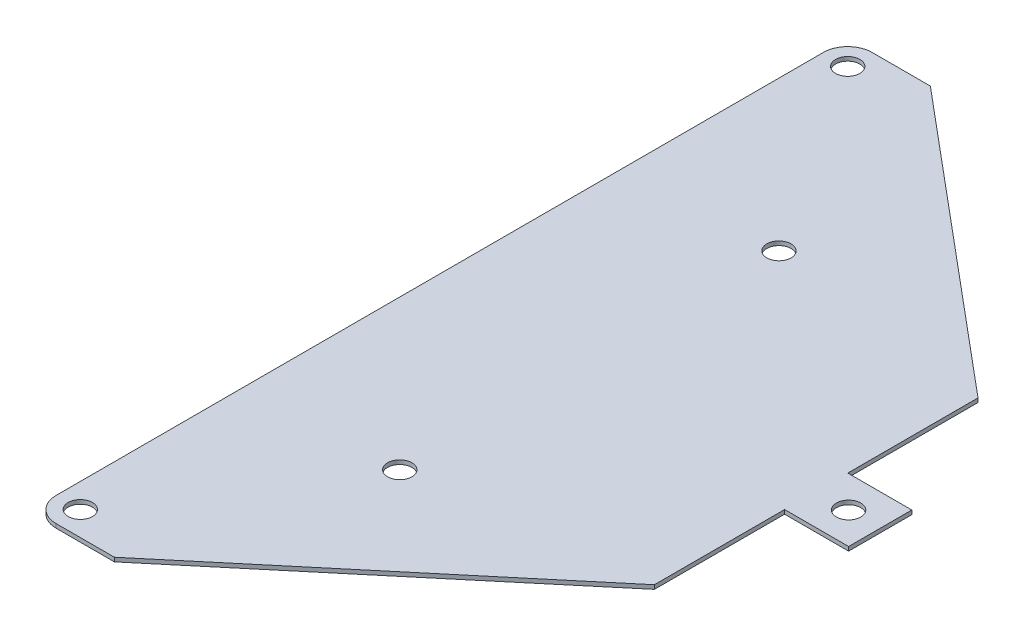
ISO-10303-21;
HEADER;
FILE_DESCRIPTION(('STEP AP214'),'2;1');
FILE_NAME('part.step','',(''),(''),'','','');
FILE_SCHEMA(('AUTOMOTIVE_DESIGN { 1 0 10303 214 1 1 1 1 }'));
ENDSEC;
DATA;
#1=APPLICATION_CONTEXT('core data for automotive mechanical design processes');
#2=APPLICATION_PROTOCOL_DEFINITION('international standard','automotive_design',2000,#1);
#3=PRODUCT_CONTEXT('',#1,'mechanical');
#4=PRODUCT('Part','Part','',(#3));
#5=PRODUCT_RELATED_PRODUCT_CATEGORY('part','',(#4));
#6=PRODUCT_DEFINITION_FORMATION('','',#4);
#7=PRODUCT_DEFINITION_CONTEXT('part definition',#1,'design');
#8=PRODUCT_DEFINITION('design','',#6,#7);
#9=PRODUCT_DEFINITION_SHAPE('','',#8);
#10=(LENGTH_UNIT() NAMED_UNIT(*) SI_UNIT(.MILLI.,.METRE.));
#11=(NAMED_UNIT(*) PLANE_ANGLE_UNIT() SI_UNIT($,.RADIAN.));
#12=(NAMED_UNIT(*) SI_UNIT($,.STERADIAN.) SOLID_ANGLE_UNIT());
#13=UNCERTAINTY_MEASURE_WITH_UNIT(LENGTH_MEASURE(1.E-05),#10,'distance_accuracy_value','');
#14=(GEOMETRIC_REPRESENTATION_CONTEXT(3) GLOBAL_UNCERTAINTY_ASSIGNED_CONTEXT((#13)) GLOBAL_UNIT_ASSIGNED_CONTEXT((#10,
#11,#12)) REPRESENTATION_CONTEXT('',''));
#15=CARTESIAN_POINT('',(0.,0.,0.));
#16=DIRECTION('',(0.,0.,1.));
#17=DIRECTION('',(1.,0.,0.));
#18=AXIS2_PLACEMENT_3D('',#15,#16,#17);
#19=CARTESIAN_POINT('',(0.,0.5,0.));
#20=DIRECTION('',(0.,-1.,0.));
#21=DIRECTION('',(0.,0.,-1.));
#22=AXIS2_PLACEMENT_3D('',#19,#20,#21);
#23=PLANE('',#22);
#24=DIRECTION('',(0.,0.,-1.));
#25=VECTOR('',#24,1.);
#26=CARTESIAN_POINT('',(43.47,0.5,43.46));
#27=LINE('',#26,#25);
#28=CARTESIAN_POINT('',(43.47,0.5,43.46));
#29=VERTEX_POINT('',#28);
#30=CARTESIAN_POINT('',(43.47,0.5,27.39));
#31=VERTEX_POINT('',#30);
#32=EDGE_CURVE('E181',#29,#31,#27,.T.);
#33=ORIENTED_EDGE('',*,*,#32,.T.);
#34=DIRECTION('',(-0.766503610582019,0.,-0.642239997948375));
#35=VECTOR('',#34,1.);
#36=CARTESIAN_POINT('',(43.47,0.5,27.39));
#37=LINE('',#36,#35);
#38=CARTESIAN_POINT('',(7.20000000000001,0.5,-3.));
#39=VERTEX_POINT('',#38);
#40=EDGE_CURVE('E112',#31,#39,#37,.T.);
#41=ORIENTED_EDGE('',*,*,#40,.T.);
#42=DIRECTION('',(-1.,0.,0.));
#43=VECTOR('',#42,1.);
#44=CARTESIAN_POINT('',(7.20000000000001,0.5,-3.));
#45=LINE('',#44,#43);
#46=CARTESIAN_POINT('',(0.,0.5,-3.));
#47=VERTEX_POINT('',#46);
#48=EDGE_CURVE('E209',#39,#47,#45,.T.);
#49=ORIENTED_EDGE('',*,*,#48,.T.);
#50=CARTESIAN_POINT('',(0.,0.5,0.));
#51=DIRECTION('',(0.,1.,0.));
#52=DIRECTION('',(0.,0.,-1.));
#53=AXIS2_PLACEMENT_3D('',#50,#51,#52);
#54=CIRCLE('',#53,3.);
#55=CARTESIAN_POINT('',(-3.,0.5,0.));
#56=VERTEX_POINT('',#55);
#57=EDGE_CURVE('E228',#47,#56,#54,.T.);
#58=ORIENTED_EDGE('',*,*,#57,.T.);
#59=DIRECTION('',(0.,0.,1.));
#60=VECTOR('',#59,1.);
#61=CARTESIAN_POINT('',(-3.,0.5,94.72));
#62=LINE('',#61,#60);
#63=CARTESIAN_POINT('',(-3.,0.5,94.72));
#64=VERTEX_POINT('',#63);
#65=EDGE_CURVE('E226',#56,#64,#62,.T.);
#66=ORIENTED_EDGE('',*,*,#65,.T.);
#67=CARTESIAN_POINT('',(0.,0.5,94.72));
#68=DIRECTION('',(0.,1.,0.));
#69=DIRECTION('',(0.,0.,-1.));
#70=AXIS2_PLACEMENT_3D('',#67,#68,#69);
#71=CIRCLE('',#70,3.);
#72=CARTESIAN_POINT('',(0.,0.5,97.72));
#73=VERTEX_POINT('',#72);
#74=EDGE_CURVE('E229',#64,#73,#71,.T.);
#75=ORIENTED_EDGE('',*,*,#74,.T.);
#76=DIRECTION('',(1.,0.,0.));
#77=VECTOR('',#76,1.);
#78=CARTESIAN_POINT('',(0.,0.5,97.72));
#79=LINE('',#78,#77);
#80=CARTESIAN_POINT('',(7.20000000000001,0.5,97.72));
#81=VERTEX_POINT('',#80);
#82=EDGE_CURVE('E233',#73,#81,#79,.T.);
#83=ORIENTED_EDGE('',*,*,#82,.T.);
#84=DIRECTION('',(0.766503610582019,0.,-0.642239997948375));
#85=VECTOR('',#84,1.);
#86=CARTESIAN_POINT('',(7.20000000000001,0.5,97.72));
#87=LINE('',#86,#85);
#88=CARTESIAN_POINT('',(43.47,0.5,67.33));
#89=VERTEX_POINT('',#88);
#90=EDGE_CURVE('E240',#81,#89,#87,.T.);
#91=ORIENTED_EDGE('',*,*,#90,.T.);
#92=DIRECTION('',(0.,0.,-1.));
#93=VECTOR('',#92,1.);
#94=CARTESIAN_POINT('',(43.47,0.5,67.33));
#95=LINE('',#94,#93);
#96=CARTESIAN_POINT('',(43.47,0.5,51.26));
#97=VERTEX_POINT('',#96);
#98=EDGE_CURVE('E142',#89,#97,#95,.T.);
#99=ORIENTED_EDGE('',*,*,#98,.T.);
#100=DIRECTION('',(1.,0.,0.));
#101=VECTOR('',#100,1.);
#102=CARTESIAN_POINT('',(51.37,0.5,51.26));
#103=LINE('',#102,#101);
#104=CARTESIAN_POINT('',(51.37,0.5,51.26));
#105=VERTEX_POINT('',#104);
#106=EDGE_CURVE('E138',#97,#105,#103,.T.);
#107=ORIENTED_EDGE('',*,*,#106,.T.);
#108=DIRECTION('',(0.,0.,-1.));
#109=VECTOR('',#108,1.);
#110=CARTESIAN_POINT('',(51.37,0.5,43.46));
#111=LINE('',#110,#109);
#112=CARTESIAN_POINT('',(51.37,0.5,43.46));
#113=VERTEX_POINT('',#112);
#114=EDGE_CURVE('E136',#105,#113,#111,.T.);
#115=ORIENTED_EDGE('',*,*,#114,.T.);
#116=DIRECTION('',(-1.,0.,0.));
#117=VECTOR('',#116,1.);
#118=CARTESIAN_POINT('',(43.47,0.5,43.46));
#119=LINE('',#118,#117);
#120=EDGE_CURVE('E57',#113,#29,#119,.T.);
#121=ORIENTED_EDGE('',*,*,#120,.T.);
#122=EDGE_LOOP('',(#33,#41,#49,#58,#66,#75,#83,#91,#99,#107,#115,#121));
#123=FACE_BOUND('',#122,.T.);
#124=CARTESIAN_POINT('',(0.,0.5,0.));
#125=DIRECTION('',(0.,1.,0.));
#126=DIRECTION('',(0.,0.,1.));
#127=AXIS2_PLACEMENT_3D('',#124,#125,#126);
#128=CIRCLE('',#127,1.5);
#129=CARTESIAN_POINT('',(0.,0.5,1.5));
#130=VERTEX_POINT('',#129);
#131=EDGE_CURVE('E163',#130,#130,#128,.T.);
#132=ORIENTED_EDGE('',*,*,#131,.F.);
#133=EDGE_LOOP('',(#132));
#134=FACE_BOUND('',#133,.T.);
#135=CARTESIAN_POINT('',(0.,0.5,94.72));
#136=DIRECTION('',(0.,1.,0.));
#137=DIRECTION('',(0.,0.,1.));
#138=AXIS2_PLACEMENT_3D('',#135,#136,#137);
#139=CIRCLE('',#138,1.5);
#140=CARTESIAN_POINT('',(0.,0.5,96.22));
#141=VERTEX_POINT('',#140);
#142=EDGE_CURVE('E313',#141,#141,#139,.T.);
#143=ORIENTED_EDGE('',*,*,#142,.F.);
#144=EDGE_LOOP('',(#143));
#145=FACE_BOUND('',#144,.T.);
#146=CARTESIAN_POINT('',(47.47,0.5,47.36));
#147=DIRECTION('',(0.,1.,0.));
#148=DIRECTION('',(0.,0.,1.));
#149=AXIS2_PLACEMENT_3D('',#146,#147,#148);
#150=CIRCLE('',#149,1.5);
#151=CARTESIAN_POINT('',(47.47,0.5,48.86));
#152=VERTEX_POINT('',#151);
#153=EDGE_CURVE('E301',#152,#152,#150,.T.);
#154=ORIENTED_EDGE('',*,*,#153,.F.);
#155=EDGE_LOOP('',(#154));
#156=FACE_BOUND('',#155,.T.);
#157=CARTESIAN_POINT('',(15.47,0.5,70.76));
#158=DIRECTION('',(0.,1.,0.));
#159=DIRECTION('',(0.,0.,1.));
#160=AXIS2_PLACEMENT_3D('',#157,#158,#159);
#161=CIRCLE('',#160,1.5);
#162=CARTESIAN_POINT('',(15.47,0.5,72.26));
#163=VERTEX_POINT('',#162);
#164=EDGE_CURVE('E298',#163,#163,#161,.T.);
#165=ORIENTED_EDGE('',*,*,#164,.F.);
#166=EDGE_LOOP('',(#165));
#167=FACE_BOUND('',#166,.T.);
#168=CARTESIAN_POINT('',(15.47,0.5,23.96));
#169=DIRECTION('',(0.,1.,0.));
#170=DIRECTION('',(0.,0.,1.));
#171=AXIS2_PLACEMENT_3D('',#168,#169,#170);
#172=CIRCLE('',#171,1.5);
#173=CARTESIAN_POINT('',(15.47,0.5,25.46));
#174=VERTEX_POINT('',#173);
#175=EDGE_CURVE('E286',#174,#174,#172,.T.);
#176=ORIENTED_EDGE('',*,*,#175,.F.);
#177=EDGE_LOOP('',(#176));
#178=FACE_BOUND('',#177,.T.);
#179=ADVANCED_FACE('F39',(#123,#134,#145,#156,#167,#178),#23,.F.);
#180=CARTESIAN_POINT('',(0.,0.,0.));
#181=DIRECTION('',(0.,-1.,0.));
#182=DIRECTION('',(0.,0.,-1.));
#183=AXIS2_PLACEMENT_3D('',#180,#181,#182);
#184=PLANE('',#183);
#185=CARTESIAN_POINT('',(15.47,0.,70.76));
#186=DIRECTION('',(0.,1.,0.));
#187=DIRECTION('',(0.,0.,1.));
#188=AXIS2_PLACEMENT_3D('',#185,#186,#187);
#189=CIRCLE('',#188,1.5);
#190=CARTESIAN_POINT('',(15.47,0.,72.26));
#191=VERTEX_POINT('',#190);
#192=EDGE_CURVE('E296',#191,#191,#189,.T.);
#193=ORIENTED_EDGE('',*,*,#192,.T.);
#194=EDGE_LOOP('',(#193));
#195=FACE_BOUND('',#194,.T.);
#196=CARTESIAN_POINT('',(0.,0.,94.72));
#197=DIRECTION('',(0.,1.,0.));
#198=DIRECTION('',(0.,0.,1.));
#199=AXIS2_PLACEMENT_3D('',#196,#197,#198);
#200=CIRCLE('',#199,1.5);
#201=CARTESIAN_POINT('',(0.,0.,96.22));
#202=VERTEX_POINT('',#201);
#203=EDGE_CURVE('E306',#202,#202,#200,.T.);
#204=ORIENTED_EDGE('',*,*,#203,.T.);
#205=EDGE_LOOP('',(#204));
#206=FACE_BOUND('',#205,.T.);
#207=DIRECTION('',(0.,0.,-1.));
#208=VECTOR('',#207,1.);
#209=CARTESIAN_POINT('',(43.47,0.,43.46));
#210=LINE('',#209,#208);
#211=CARTESIAN_POINT('',(43.47,0.,43.46));
#212=VERTEX_POINT('',#211);
#213=CARTESIAN_POINT('',(43.47,0.,27.39));
#214=VERTEX_POINT('',#213);
#215=EDGE_CURVE('E159',#212,#214,#210,.T.);
#216=ORIENTED_EDGE('',*,*,#215,.F.);
#217=DIRECTION('',(-1.,0.,0.));
#218=VECTOR('',#217,1.);
#219=CARTESIAN_POINT('',(43.47,0.,43.46));
#220=LINE('',#219,#218);
#221=CARTESIAN_POINT('',(51.37,0.,43.46));
#222=VERTEX_POINT('',#221);
#223=EDGE_CURVE('E103',#222,#212,#220,.T.);
#224=ORIENTED_EDGE('',*,*,#223,.F.);
#225=DIRECTION('',(0.,0.,-1.));
#226=VECTOR('',#225,1.);
#227=CARTESIAN_POINT('',(51.37,0.,43.46));
#228=LINE('',#227,#226);
#229=CARTESIAN_POINT('',(51.37,0.,51.26));
#230=VERTEX_POINT('',#229);
#231=EDGE_CURVE('E100',#230,#222,#228,.T.);
#232=ORIENTED_EDGE('',*,*,#231,.F.);
#233=DIRECTION('',(1.,0.,0.));
#234=VECTOR('',#233,1.);
#235=CARTESIAN_POINT('',(51.37,0.,51.26));
#236=LINE('',#235,#234);
#237=CARTESIAN_POINT('',(43.47,0.,51.26));
#238=VERTEX_POINT('',#237);
#239=EDGE_CURVE('E147',#238,#230,#236,.T.);
#240=ORIENTED_EDGE('',*,*,#239,.F.);
#241=DIRECTION('',(0.,0.,-1.));
#242=VECTOR('',#241,1.);
#243=CARTESIAN_POINT('',(43.47,0.,67.33));
#244=LINE('',#243,#242);
#245=CARTESIAN_POINT('',(43.47,0.,67.33));
#246=VERTEX_POINT('',#245);
#247=EDGE_CURVE('E177',#246,#238,#244,.T.);
#248=ORIENTED_EDGE('',*,*,#247,.F.);
#249=DIRECTION('',(0.766503610582019,0.,-0.642239997948375));
#250=VECTOR('',#249,1.);
#251=CARTESIAN_POINT('',(7.20000000000001,0.,97.72));
#252=LINE('',#251,#250);
#253=CARTESIAN_POINT('',(7.20000000000001,0.,97.72));
#254=VERTEX_POINT('',#253);
#255=EDGE_CURVE('E178',#254,#246,#252,.T.);
#256=ORIENTED_EDGE('',*,*,#255,.F.);
#257=DIRECTION('',(1.,0.,0.));
#258=VECTOR('',#257,1.);
#259=CARTESIAN_POINT('',(0.,0.,97.72));
#260=LINE('',#259,#258);
#261=CARTESIAN_POINT('',(0.,0.,97.72));
#262=VERTEX_POINT('',#261);
#263=EDGE_CURVE('E173',#262,#254,#260,.T.);
#264=ORIENTED_EDGE('',*,*,#263,.F.);
#265=CARTESIAN_POINT('',(0.,0.,94.72));
#266=DIRECTION('',(0.,1.,0.));
#267=DIRECTION('',(0.,0.,-1.));
#268=AXIS2_PLACEMENT_3D('',#265,#266,#267);
#269=CIRCLE('',#268,3.);
#270=CARTESIAN_POINT('',(-3.,0.,94.72));
#271=VERTEX_POINT('',#270);
#272=EDGE_CURVE('E172',#271,#262,#269,.T.);
#273=ORIENTED_EDGE('',*,*,#272,.F.);
#274=DIRECTION('',(0.,0.,1.));
#275=VECTOR('',#274,1.);
#276=CARTESIAN_POINT('',(-3.,0.,94.72));
#277=LINE('',#276,#275);
#278=CARTESIAN_POINT('',(-3.,0.,0.));
#279=VERTEX_POINT('',#278);
#280=EDGE_CURVE('E168',#279,#271,#277,.T.);
#281=ORIENTED_EDGE('',*,*,#280,.F.);
#282=CARTESIAN_POINT('',(0.,0.,0.));
#283=DIRECTION('',(0.,1.,0.));
#284=DIRECTION('',(0.,0.,-1.));
#285=AXIS2_PLACEMENT_3D('',#282,#283,#284);
#286=CIRCLE('',#285,3.);
#287=CARTESIAN_POINT('',(0.,0.,-3.));
#288=VERTEX_POINT('',#287);
#289=EDGE_CURVE('E169',#288,#279,#286,.T.);
#290=ORIENTED_EDGE('',*,*,#289,.F.);
#291=DIRECTION('',(-1.,0.,0.));
#292=VECTOR('',#291,1.);
#293=CARTESIAN_POINT('',(7.20000000000001,0.,-3.));
#294=LINE('',#293,#292);
#295=CARTESIAN_POINT('',(7.20000000000001,0.,-3.));
#296=VERTEX_POINT('',#295);
#297=EDGE_CURVE('E167',#296,#288,#294,.T.);
#298=ORIENTED_EDGE('',*,*,#297,.F.);
#299=DIRECTION('',(-0.766503610582019,0.,-0.642239997948375));
#300=VECTOR('',#299,1.);
#301=CARTESIAN_POINT('',(43.47,0.,27.39));
#302=LINE('',#301,#300);
#303=EDGE_CURVE('E162',#214,#296,#302,.T.);
#304=ORIENTED_EDGE('',*,*,#303,.F.);
#305=EDGE_LOOP('',(#216,#224,#232,#240,#248,#256,#264,#273,#281,#290,#298,#304));
#306=FACE_BOUND('',#305,.T.);
#307=CARTESIAN_POINT('',(0.,0.,0.));
#308=DIRECTION('',(0.,1.,0.));
#309=DIRECTION('',(0.,0.,1.));
#310=AXIS2_PLACEMENT_3D('',#307,#308,#309);
#311=CIRCLE('',#310,1.5);
#312=CARTESIAN_POINT('',(0.,0.,1.5));
#313=VERTEX_POINT('',#312);
#314=EDGE_CURVE('E314',#313,#313,#311,.T.);
#315=ORIENTED_EDGE('',*,*,#314,.T.);
#316=EDGE_LOOP('',(#315));
#317=FACE_BOUND('',#316,.T.);
#318=CARTESIAN_POINT('',(47.47,0.,47.36));
#319=DIRECTION('',(0.,1.,0.));
#320=DIRECTION('',(0.,0.,1.));
#321=AXIS2_PLACEMENT_3D('',#318,#319,#320);
#322=CIRCLE('',#321,1.5);
#323=CARTESIAN_POINT('',(47.47,0.,48.86));
#324=VERTEX_POINT('',#323);
#325=EDGE_CURVE('E304',#324,#324,#322,.T.);
#326=ORIENTED_EDGE('',*,*,#325,.T.);
#327=EDGE_LOOP('',(#326));
#328=FACE_BOUND('',#327,.T.);
#329=CARTESIAN_POINT('',(15.47,0.,23.96));
#330=DIRECTION('',(0.,1.,0.));
#331=DIRECTION('',(0.,0.,1.));
#332=AXIS2_PLACEMENT_3D('',#329,#330,#331);
#333=CIRCLE('',#332,1.5);
#334=CARTESIAN_POINT('',(15.47,0.,25.46));
#335=VERTEX_POINT('',#334);
#336=EDGE_CURVE('E291',#335,#335,#333,.T.);
#337=ORIENTED_EDGE('',*,*,#336,.T.);
#338=EDGE_LOOP('',(#337));
#339=FACE_BOUND('',#338,.T.);
#340=ADVANCED_FACE('F212',(#195,#206,#306,#317,#328,#339),#184,.T.);
#341=CARTESIAN_POINT('',(43.47,0.5,43.46));
#342=DIRECTION('',(-1.,0.,0.));
#343=DIRECTION('',(0.,0.,1.));
#344=AXIS2_PLACEMENT_3D('',#341,#342,#343);
#345=PLANE('',#344);
#346=ORIENTED_EDGE('',*,*,#215,.T.);
#347=DIRECTION('',(0.,-1.,0.));
#348=VECTOR('',#347,1.);
#349=CARTESIAN_POINT('',(43.47,0.5,27.39));
#350=LINE('',#349,#348);
#351=EDGE_CURVE('E11',#31,#214,#350,.T.);
#352=ORIENTED_EDGE('',*,*,#351,.F.);
#353=ORIENTED_EDGE('',*,*,#32,.F.);
#354=DIRECTION('',(0.,-1.,0.));
#355=VECTOR('',#354,1.);
#356=CARTESIAN_POINT('',(43.47,0.5,43.46));
#357=LINE('',#356,#355);
#358=EDGE_CURVE('E156',#29,#212,#357,.T.);
#359=ORIENTED_EDGE('',*,*,#358,.T.);
#360=EDGE_LOOP('',(#346,#352,#353,#359));
#361=FACE_BOUND('',#360,.T.);
#362=ADVANCED_FACE('F41',(#361),#345,.F.);
#363=CARTESIAN_POINT('',(43.47,0.5,27.39));
#364=DIRECTION('',(-0.642239997948375,0.,0.766503610582019));
#365=DIRECTION('',(0.766503610582019,0.,0.642239997948375));
#366=AXIS2_PLACEMENT_3D('',#363,#364,#365);
#367=PLANE('',#366);
#368=ORIENTED_EDGE('',*,*,#303,.T.);
#369=DIRECTION('',(0.,-1.,0.));
#370=VECTOR('',#369,1.);
#371=CARTESIAN_POINT('',(7.20000000000001,0.5,-3.));
#372=LINE('',#371,#370);
#373=EDGE_CURVE('E48',#39,#296,#372,.T.);
#374=ORIENTED_EDGE('',*,*,#373,.F.);
#375=ORIENTED_EDGE('',*,*,#40,.F.);
#376=ORIENTED_EDGE('',*,*,#351,.T.);
#377=EDGE_LOOP('',(#368,#374,#375,#376));
#378=FACE_BOUND('',#377,.T.);
#379=ADVANCED_FACE('F439',(#378),#367,.F.);
#380=CARTESIAN_POINT('',(7.20000000000001,0.5,-3.));
#381=DIRECTION('',(0.,0.,1.));
#382=DIRECTION('',(1.,0.,0.));
#383=AXIS2_PLACEMENT_3D('',#380,#381,#382);
#384=PLANE('',#383);
#385=ORIENTED_EDGE('',*,*,#297,.T.);
#386=DIRECTION('',(0.,-1.,0.));
#387=VECTOR('',#386,1.);
#388=CARTESIAN_POINT('',(0.,0.5,-3.));
#389=LINE('',#388,#387);
#390=EDGE_CURVE('E205',#47,#288,#389,.T.);
#391=ORIENTED_EDGE('',*,*,#390,.F.);
#392=ORIENTED_EDGE('',*,*,#48,.F.);
#393=ORIENTED_EDGE('',*,*,#373,.T.);
#394=EDGE_LOOP('',(#385,#391,#392,#393));
#395=FACE_BOUND('',#394,.T.);
#396=ADVANCED_FACE('F208',(#395),#384,.F.);
#397=CARTESIAN_POINT('',(0.,0.5,0.));
#398=DIRECTION('',(0.,-1.,0.));
#399=DIRECTION('',(0.,0.,-1.));
#400=AXIS2_PLACEMENT_3D('',#397,#398,#399);
#401=CYLINDRICAL_SURFACE('',#400,3.);
#402=ORIENTED_EDGE('',*,*,#289,.T.);
#403=DIRECTION('',(0.,-1.,0.));
#404=VECTOR('',#403,1.);
#405=CARTESIAN_POINT('',(-3.,0.5,0.));
#406=LINE('',#405,#404);
#407=EDGE_CURVE('E200',#56,#279,#406,.T.);
#408=ORIENTED_EDGE('',*,*,#407,.F.);
#409=ORIENTED_EDGE('',*,*,#57,.F.);
#410=ORIENTED_EDGE('',*,*,#390,.T.);
#411=EDGE_LOOP('',(#402,#408,#409,#410));
#412=FACE_BOUND('',#411,.T.);
#413=ADVANCED_FACE('F219',(#412),#401,.T.);
#414=CARTESIAN_POINT('',(-3.,0.5,94.72));
#415=DIRECTION('',(1.,0.,0.));
#416=DIRECTION('',(0.,0.,-1.));
#417=AXIS2_PLACEMENT_3D('',#414,#415,#416);
#418=PLANE('',#417);
#419=ORIENTED_EDGE('',*,*,#280,.T.);
#420=DIRECTION('',(0.,-1.,0.));
#421=VECTOR('',#420,1.);
#422=CARTESIAN_POINT('',(-3.,0.5,94.72));
#423=LINE('',#422,#421);
#424=EDGE_CURVE('E198',#64,#271,#423,.T.);
#425=ORIENTED_EDGE('',*,*,#424,.F.);
#426=ORIENTED_EDGE('',*,*,#65,.F.);
#427=ORIENTED_EDGE('',*,*,#407,.T.);
#428=EDGE_LOOP('',(#419,#425,#426,#427));
#429=FACE_BOUND('',#428,.T.);
#430=ADVANCED_FACE('F221',(#429),#418,.F.);
#431=CARTESIAN_POINT('',(0.,0.5,94.72));
#432=DIRECTION('',(0.,-1.,0.));
#433=DIRECTION('',(0.,0.,-1.));
#434=AXIS2_PLACEMENT_3D('',#431,#432,#433);
#435=CYLINDRICAL_SURFACE('',#434,3.);
#436=ORIENTED_EDGE('',*,*,#272,.T.);
#437=DIRECTION('',(0.,-1.,0.));
#438=VECTOR('',#437,1.);
#439=CARTESIAN_POINT('',(0.,0.5,97.72));
#440=LINE('',#439,#438);
#441=EDGE_CURVE('E192',#73,#262,#440,.T.);
#442=ORIENTED_EDGE('',*,*,#441,.F.);
#443=ORIENTED_EDGE('',*,*,#74,.F.);
#444=ORIENTED_EDGE('',*,*,#424,.T.);
#445=EDGE_LOOP('',(#436,#442,#443,#444));
#446=FACE_BOUND('',#445,.T.);
#447=ADVANCED_FACE('F403',(#446),#435,.T.);
#448=CARTESIAN_POINT('',(0.,0.5,97.72));
#449=DIRECTION('',(0.,0.,-1.));
#450=DIRECTION('',(-1.,0.,0.));
#451=AXIS2_PLACEMENT_3D('',#448,#449,#450);
#452=PLANE('',#451);
#453=ORIENTED_EDGE('',*,*,#263,.T.);
#454=DIRECTION('',(0.,-1.,0.));
#455=VECTOR('',#454,1.);
#456=CARTESIAN_POINT('',(7.20000000000001,0.5,97.72));
#457=LINE('',#456,#455);
#458=EDGE_CURVE('E190',#81,#254,#457,.T.);
#459=ORIENTED_EDGE('',*,*,#458,.F.);
#460=ORIENTED_EDGE('',*,*,#82,.F.);
#461=ORIENTED_EDGE('',*,*,#441,.T.);
#462=EDGE_LOOP('',(#453,#459,#460,#461));
#463=FACE_BOUND('',#462,.T.);
#464=ADVANCED_FACE('F398',(#463),#452,.F.);
#465=CARTESIAN_POINT('',(7.20000000000001,0.5,97.72));
#466=DIRECTION('',(-0.642239997948375,0.,-0.766503610582019));
#467=DIRECTION('',(-0.766503610582019,0.,0.642239997948375));
#468=AXIS2_PLACEMENT_3D('',#465,#466,#467);
#469=PLANE('',#468);
#470=ORIENTED_EDGE('',*,*,#255,.T.);
#471=DIRECTION('',(0.,-1.,0.));
#472=VECTOR('',#471,1.);
#473=CARTESIAN_POINT('',(43.47,0.5,67.33));
#474=LINE('',#473,#472);
#475=EDGE_CURVE('E187',#89,#246,#474,.T.);
#476=ORIENTED_EDGE('',*,*,#475,.F.);
#477=ORIENTED_EDGE('',*,*,#90,.F.);
#478=ORIENTED_EDGE('',*,*,#458,.T.);
#479=EDGE_LOOP('',(#470,#476,#477,#478));
#480=FACE_BOUND('',#479,.T.);
#481=ADVANCED_FACE('F244',(#480),#469,.F.);
#482=CARTESIAN_POINT('',(43.47,0.5,67.33));
#483=DIRECTION('',(-1.,0.,0.));
#484=DIRECTION('',(0.,0.,1.));
#485=AXIS2_PLACEMENT_3D('',#482,#483,#484);
#486=PLANE('',#485);
#487=ORIENTED_EDGE('',*,*,#247,.T.);
#488=DIRECTION('',(0.,-1.,0.));
#489=VECTOR('',#488,1.);
#490=CARTESIAN_POINT('',(43.47,0.5,51.26));
#491=LINE('',#490,#489);
#492=EDGE_CURVE('E151',#97,#238,#491,.T.);
#493=ORIENTED_EDGE('',*,*,#492,.F.);
#494=ORIENTED_EDGE('',*,*,#98,.F.);
#495=ORIENTED_EDGE('',*,*,#475,.T.);
#496=EDGE_LOOP('',(#487,#493,#494,#495));
#497=FACE_BOUND('',#496,.T.);
#498=ADVANCED_FACE('F249',(#497),#486,.F.);
#499=CARTESIAN_POINT('',(51.37,0.5,51.26));
#500=DIRECTION('',(0.,0.,-1.));
#501=DIRECTION('',(-1.,0.,0.));
#502=AXIS2_PLACEMENT_3D('',#499,#500,#501);
#503=PLANE('',#502);
#504=ORIENTED_EDGE('',*,*,#239,.T.);
#505=DIRECTION('',(0.,-1.,0.));
#506=VECTOR('',#505,1.);
#507=CARTESIAN_POINT('',(51.37,0.5,51.26));
#508=LINE('',#507,#506);
#509=EDGE_CURVE('E150',#105,#230,#508,.T.);
#510=ORIENTED_EDGE('',*,*,#509,.F.);
#511=ORIENTED_EDGE('',*,*,#106,.F.);
#512=ORIENTED_EDGE('',*,*,#492,.T.);
#513=EDGE_LOOP('',(#504,#510,#511,#512));
#514=FACE_BOUND('',#513,.T.);
#515=ADVANCED_FACE('F146',(#514),#503,.F.);
#516=CARTESIAN_POINT('',(51.37,0.5,43.46));
#517=DIRECTION('',(-1.,0.,0.));
#518=DIRECTION('',(0.,0.,1.));
#519=AXIS2_PLACEMENT_3D('',#516,#517,#518);
#520=PLANE('',#519);
#521=ORIENTED_EDGE('',*,*,#231,.T.);
#522=DIRECTION('',(0.,-1.,0.));
#523=VECTOR('',#522,1.);
#524=CARTESIAN_POINT('',(51.37,0.5,43.46));
#525=LINE('',#524,#523);
#526=EDGE_CURVE('E155',#113,#222,#525,.T.);
#527=ORIENTED_EDGE('',*,*,#526,.F.);
#528=ORIENTED_EDGE('',*,*,#114,.F.);
#529=ORIENTED_EDGE('',*,*,#509,.T.);
#530=EDGE_LOOP('',(#521,#527,#528,#529));
#531=FACE_BOUND('',#530,.T.);
#532=ADVANCED_FACE('F152',(#531),#520,.F.);
#533=CARTESIAN_POINT('',(43.47,0.5,43.46));
#534=DIRECTION('',(0.,0.,1.));
#535=DIRECTION('',(1.,0.,0.));
#536=AXIS2_PLACEMENT_3D('',#533,#534,#535);
#537=PLANE('',#536);
#538=ORIENTED_EDGE('',*,*,#223,.T.);
#539=ORIENTED_EDGE('',*,*,#358,.F.);
#540=ORIENTED_EDGE('',*,*,#120,.F.);
#541=ORIENTED_EDGE('',*,*,#526,.T.);
#542=EDGE_LOOP('',(#538,#539,#540,#541));
#543=FACE_BOUND('',#542,.T.);
#544=ADVANCED_FACE('F253',(#543),#537,.F.);
#545=CARTESIAN_POINT('',(0.,0.5,0.));
#546=DIRECTION('',(0.,-1.,0.));
#547=DIRECTION('',(0.,0.,-1.));
#548=AXIS2_PLACEMENT_3D('',#545,#546,#547);
#549=CYLINDRICAL_SURFACE('',#548,1.5);
#550=ORIENTED_EDGE('',*,*,#131,.T.);
#551=EDGE_LOOP('',(#550));
#552=FACE_BOUND('',#551,.T.);
#553=ORIENTED_EDGE('',*,*,#314,.F.);
#554=EDGE_LOOP('',(#553));
#555=FACE_BOUND('',#554,.T.);
#556=ADVANCED_FACE('F251',(#552,#555),#549,.F.);
#557=CARTESIAN_POINT('',(0.,0.5,94.72));
#558=DIRECTION('',(0.,-1.,0.));
#559=DIRECTION('',(0.,0.,-1.));
#560=AXIS2_PLACEMENT_3D('',#557,#558,#559);
#561=CYLINDRICAL_SURFACE('',#560,1.5);
#562=ORIENTED_EDGE('',*,*,#142,.T.);
#563=EDGE_LOOP('',(#562));
#564=FACE_BOUND('',#563,.T.);
#565=ORIENTED_EDGE('',*,*,#203,.F.);
#566=EDGE_LOOP('',(#565));
#567=FACE_BOUND('',#566,.T.);
#568=ADVANCED_FACE('F259',(#564,#567),#561,.F.);
#569=CARTESIAN_POINT('',(47.47,0.5,47.36));
#570=DIRECTION('',(0.,-1.,0.));
#571=DIRECTION('',(0.,0.,-1.));
#572=AXIS2_PLACEMENT_3D('',#569,#570,#571);
#573=CYLINDRICAL_SURFACE('',#572,1.5);
#574=ORIENTED_EDGE('',*,*,#153,.T.);
#575=EDGE_LOOP('',(#574));
#576=FACE_BOUND('',#575,.T.);
#577=ORIENTED_EDGE('',*,*,#325,.F.);
#578=EDGE_LOOP('',(#577));
#579=FACE_BOUND('',#578,.T.);
#580=ADVANCED_FACE('F272',(#576,#579),#573,.F.);
#581=CARTESIAN_POINT('',(15.47,0.5,70.76));
#582=DIRECTION('',(0.,-1.,0.));
#583=DIRECTION('',(0.,0.,-1.));
#584=AXIS2_PLACEMENT_3D('',#581,#582,#583);
#585=CYLINDRICAL_SURFACE('',#584,1.5);
#586=ORIENTED_EDGE('',*,*,#164,.T.);
#587=EDGE_LOOP('',(#586));
#588=FACE_BOUND('',#587,.T.);
#589=ORIENTED_EDGE('',*,*,#192,.F.);
#590=EDGE_LOOP('',(#589));
#591=FACE_BOUND('',#590,.T.);
#592=ADVANCED_FACE('F280',(#588,#591),#585,.F.);
#593=CARTESIAN_POINT('',(15.47,0.5,23.96));
#594=DIRECTION('',(0.,-1.,0.));
#595=DIRECTION('',(0.,0.,-1.));
#596=AXIS2_PLACEMENT_3D('',#593,#594,#595);
#597=CYLINDRICAL_SURFACE('',#596,1.5);
#598=ORIENTED_EDGE('',*,*,#175,.T.);
#599=EDGE_LOOP('',(#598));
#600=FACE_BOUND('',#599,.T.);
#601=ORIENTED_EDGE('',*,*,#336,.F.);
#602=EDGE_LOOP('',(#601));
#603=FACE_BOUND('',#602,.T.);
#604=ADVANCED_FACE('F281',(#600,#603),#597,.F.);
#605=CLOSED_SHELL('',(#179,#340,#362,#379,#396,#413,#430,#447,#464,#481,#498,#515,#532,#544,
#556,#568,#580,#592,#604));
#606=MANIFOLD_SOLID_BREP('B2',#605);
#607=ADVANCED_BREP_SHAPE_REPRESENTATION('',(#18,#606),#14);
#608=SHAPE_DEFINITION_REPRESENTATION(#9,#607);
ENDSEC;
END-ISO-10303-21;
